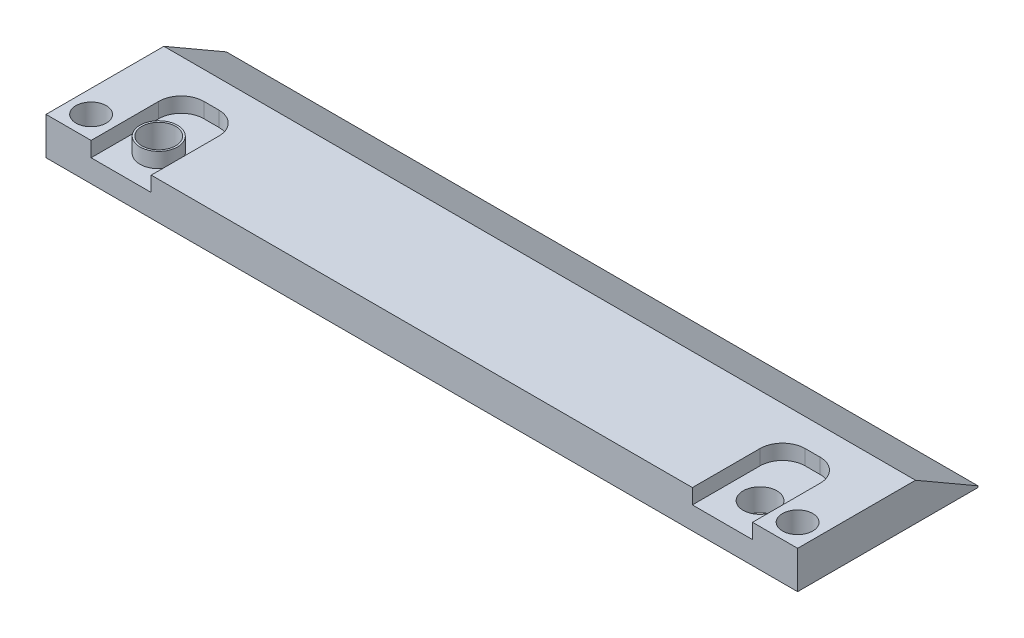
ISO-10303-21;
HEADER;
FILE_DESCRIPTION(('STEP AP214'),'2;1');
FILE_NAME('part.step','',(''),(''),'','','');
FILE_SCHEMA(('AUTOMOTIVE_DESIGN { 1 0 10303 214 1 1 1 1 }'));
ENDSEC;
DATA;
#1=APPLICATION_CONTEXT('core data for automotive mechanical design processes');
#2=APPLICATION_PROTOCOL_DEFINITION('international standard','automotive_design',2000,#1);
#3=PRODUCT_CONTEXT('',#1,'mechanical');
#4=PRODUCT('Part','Part','',(#3));
#5=PRODUCT_RELATED_PRODUCT_CATEGORY('part','',(#4));
#6=PRODUCT_DEFINITION_FORMATION('','',#4);
#7=PRODUCT_DEFINITION_CONTEXT('part definition',#1,'design');
#8=PRODUCT_DEFINITION('design','',#6,#7);
#9=PRODUCT_DEFINITION_SHAPE('','',#8);
#10=(LENGTH_UNIT() NAMED_UNIT(*) SI_UNIT(.MILLI.,.METRE.));
#11=(NAMED_UNIT(*) PLANE_ANGLE_UNIT() SI_UNIT($,.RADIAN.));
#12=(NAMED_UNIT(*) SI_UNIT($,.STERADIAN.) SOLID_ANGLE_UNIT());
#13=UNCERTAINTY_MEASURE_WITH_UNIT(LENGTH_MEASURE(1.E-05),#10,'distance_accuracy_value','');
#14=(GEOMETRIC_REPRESENTATION_CONTEXT(3) GLOBAL_UNCERTAINTY_ASSIGNED_CONTEXT((#13)) GLOBAL_UNIT_ASSIGNED_CONTEXT((#10,
#11,#12)) REPRESENTATION_CONTEXT('',''));
#15=CARTESIAN_POINT('',(0.,0.,0.));
#16=DIRECTION('',(0.,0.,1.));
#17=DIRECTION('',(1.,0.,0.));
#18=AXIS2_PLACEMENT_3D('',#15,#16,#17);
#19=CARTESIAN_POINT('',(40.,5.,6.99999999999999));
#20=DIRECTION('',(0.,-1.,0.));
#21=DIRECTION('',(0.,0.,-1.));
#22=AXIS2_PLACEMENT_3D('',#19,#20,#21);
#23=CYLINDRICAL_SURFACE('',#22,2.25);
#24=CARTESIAN_POINT('',(40.,0.,6.99999999999999));
#25=DIRECTION('',(0.,1.,0.));
#26=DIRECTION('',(0.,0.,1.));
#27=AXIS2_PLACEMENT_3D('',#24,#25,#26);
#28=CIRCLE('',#27,2.25);
#29=CARTESIAN_POINT('',(40.,0.,9.24999999999999));
#30=VERTEX_POINT('',#29);
#31=EDGE_CURVE('E323',#30,#30,#28,.F.);
#32=ORIENTED_EDGE('',*,*,#31,.T.);
#33=EDGE_LOOP('',(#32));
#34=FACE_BOUND('',#33,.T.);
#35=CARTESIAN_POINT('',(40.,3.,6.99999999999999));
#36=DIRECTION('',(0.,1.,0.));
#37=DIRECTION('',(0.,0.,1.));
#38=AXIS2_PLACEMENT_3D('',#35,#36,#37);
#39=CIRCLE('',#38,2.25);
#40=CARTESIAN_POINT('',(40.,3.,9.24999999999999));
#41=VERTEX_POINT('',#40);
#42=EDGE_CURVE('E199',#41,#41,#39,.F.);
#43=ORIENTED_EDGE('',*,*,#42,.F.);
#44=EDGE_LOOP('',(#43));
#45=FACE_BOUND('',#44,.T.);
#46=ADVANCED_FACE('F41',(#34,#45),#23,.F.);
#47=CARTESIAN_POINT('',(0.,5.,0.));
#48=DIRECTION('',(0.,1.,0.));
#49=DIRECTION('',(0.,0.,1.));
#50=AXIS2_PLACEMENT_3D('',#47,#48,#49);
#51=PLANE('',#50);
#52=CARTESIAN_POINT('',(-40.,5.,7.));
#53=DIRECTION('',(0.,1.,0.));
#54=DIRECTION('',(0.,0.,1.));
#55=AXIS2_PLACEMENT_3D('',#52,#53,#54);
#56=CIRCLE('',#55,2.25);
#57=CARTESIAN_POINT('',(-40.,5.,9.25));
#58=VERTEX_POINT('',#57);
#59=EDGE_CURVE('E182',#58,#58,#56,.T.);
#60=ORIENTED_EDGE('',*,*,#59,.F.);
#61=EDGE_LOOP('',(#60));
#62=FACE_BOUND('',#61,.T.);
#63=CARTESIAN_POINT('',(-40.,5.,7.00000000000033));
#64=DIRECTION('',(0.,1.,0.));
#65=DIRECTION('',(0.,0.,1.));
#66=AXIS2_PLACEMENT_3D('',#63,#64,#65);
#67=CIRCLE('',#66,2.5);
#68=CARTESIAN_POINT('',(-40.,5.,9.50000000000033));
#69=VERTEX_POINT('',#68);
#70=EDGE_CURVE('E281',#69,#69,#67,.T.);
#71=ORIENTED_EDGE('',*,*,#70,.T.);
#72=EDGE_LOOP('',(#71));
#73=FACE_BOUND('',#72,.T.);
#74=ADVANCED_FACE('F352',(#62,#73),#51,.T.);
#75=CARTESIAN_POINT('',(-50.,5.,0.));
#76=DIRECTION('',(1.,0.,0.));
#77=DIRECTION('',(0.,0.,-1.));
#78=AXIS2_PLACEMENT_3D('',#75,#76,#77);
#79=PLANE('',#78);
#80=DIRECTION('',(0.,0.,1.));
#81=VECTOR('',#80,1.);
#82=CARTESIAN_POINT('',(-50.,5.,0.));
#83=LINE('',#82,#81);
#84=CARTESIAN_POINT('',(-50.,5.,-3.68615612366942));
#85=VERTEX_POINT('',#84);
#86=CARTESIAN_POINT('',(-50.,5.,12.));
#87=VERTEX_POINT('',#86);
#88=EDGE_CURVE('E173',#85,#87,#83,.T.);
#89=ORIENTED_EDGE('',*,*,#88,.F.);
#90=DIRECTION('',(0.,0.500000000000001,0.866025403784438));
#91=VECTOR('',#90,1.);
#92=CARTESIAN_POINT('',(-50.,5.34615242270664,-3.08660254037846));
#93=LINE('',#92,#91);
#94=CARTESIAN_POINT('',(-50.,0.2,-12.));
#95=VERTEX_POINT('',#94);
#96=EDGE_CURVE('E56',#95,#85,#93,.T.);
#97=ORIENTED_EDGE('',*,*,#96,.F.);
#98=DIRECTION('',(0.,-1.,0.));
#99=VECTOR('',#98,1.);
#100=CARTESIAN_POINT('',(-50.,5.,-12.));
#101=LINE('',#100,#99);
#102=CARTESIAN_POINT('',(-50.,0.,-12.));
#103=VERTEX_POINT('',#102);
#104=EDGE_CURVE('E170',#95,#103,#101,.T.);
#105=ORIENTED_EDGE('',*,*,#104,.T.);
#106=DIRECTION('',(0.,0.,1.));
#107=VECTOR('',#106,1.);
#108=CARTESIAN_POINT('',(-50.,0.,0.));
#109=LINE('',#108,#107);
#110=CARTESIAN_POINT('',(-50.,0.,12.));
#111=VERTEX_POINT('',#110);
#112=EDGE_CURVE('E202',#103,#111,#109,.T.);
#113=ORIENTED_EDGE('',*,*,#112,.T.);
#114=DIRECTION('',(0.,-1.,0.));
#115=VECTOR('',#114,1.);
#116=CARTESIAN_POINT('',(-50.,5.,12.));
#117=LINE('',#116,#115);
#118=EDGE_CURVE('E50',#87,#111,#117,.T.);
#119=ORIENTED_EDGE('',*,*,#118,.F.);
#120=EDGE_LOOP('',(#89,#97,#105,#113,#119));
#121=FACE_BOUND('',#120,.T.);
#122=ADVANCED_FACE('F43',(#121),#79,.F.);
#123=CARTESIAN_POINT('',(0.,5.,12.));
#124=DIRECTION('',(0.,0.,-1.));
#125=DIRECTION('',(-1.,0.,0.));
#126=AXIS2_PLACEMENT_3D('',#123,#124,#125);
#127=PLANE('',#126);
#128=DIRECTION('',(1.,0.,0.));
#129=VECTOR('',#128,1.);
#130=CARTESIAN_POINT('',(0.,5.,12.));
#131=LINE('',#130,#129);
#132=CARTESIAN_POINT('',(-36.,5.,12.));
#133=VERTEX_POINT('',#132);
#134=CARTESIAN_POINT('',(36.,5.,12.));
#135=VERTEX_POINT('',#134);
#136=EDGE_CURVE('E304',#133,#135,#131,.T.);
#137=ORIENTED_EDGE('',*,*,#136,.F.);
#138=DIRECTION('',(0.,1.,0.));
#139=VECTOR('',#138,1.);
#140=CARTESIAN_POINT('',(-36.,3.,12.));
#141=LINE('',#140,#139);
#142=CARTESIAN_POINT('',(-36.,3.,12.));
#143=VERTEX_POINT('',#142);
#144=EDGE_CURVE('E203',#143,#133,#141,.T.);
#145=ORIENTED_EDGE('',*,*,#144,.F.);
#146=DIRECTION('',(1.,0.,0.));
#147=VECTOR('',#146,1.);
#148=CARTESIAN_POINT('',(-44.,3.,12.));
#149=LINE('',#148,#147);
#150=CARTESIAN_POINT('',(-44.,3.,12.));
#151=VERTEX_POINT('',#150);
#152=EDGE_CURVE('E232',#151,#143,#149,.T.);
#153=ORIENTED_EDGE('',*,*,#152,.F.);
#154=DIRECTION('',(0.,1.,0.));
#155=VECTOR('',#154,1.);
#156=CARTESIAN_POINT('',(-44.,3.,12.));
#157=LINE('',#156,#155);
#158=CARTESIAN_POINT('',(-44.,5.,12.));
#159=VERTEX_POINT('',#158);
#160=EDGE_CURVE('E210',#151,#159,#157,.T.);
#161=ORIENTED_EDGE('',*,*,#160,.T.);
#162=EDGE_CURVE('E299',#87,#159,#131,.T.);
#163=ORIENTED_EDGE('',*,*,#162,.F.);
#164=ORIENTED_EDGE('',*,*,#118,.T.);
#165=DIRECTION('',(1.,0.,0.));
#166=VECTOR('',#165,1.);
#167=CARTESIAN_POINT('',(0.,0.,12.));
#168=LINE('',#167,#166);
#169=CARTESIAN_POINT('',(50.,0.,12.));
#170=VERTEX_POINT('',#169);
#171=EDGE_CURVE('E208',#111,#170,#168,.T.);
#172=ORIENTED_EDGE('',*,*,#171,.T.);
#173=DIRECTION('',(0.,-1.,0.));
#174=VECTOR('',#173,1.);
#175=CARTESIAN_POINT('',(50.,5.,12.));
#176=LINE('',#175,#174);
#177=CARTESIAN_POINT('',(50.,5.,12.));
#178=VERTEX_POINT('',#177);
#179=EDGE_CURVE('E186',#178,#170,#176,.T.);
#180=ORIENTED_EDGE('',*,*,#179,.F.);
#181=CARTESIAN_POINT('',(44.,5.,12.));
#182=VERTEX_POINT('',#181);
#183=EDGE_CURVE('E298',#182,#178,#131,.T.);
#184=ORIENTED_EDGE('',*,*,#183,.F.);
#185=DIRECTION('',(0.,1.,0.));
#186=VECTOR('',#185,1.);
#187=CARTESIAN_POINT('',(44.,3.,12.));
#188=LINE('',#187,#186);
#189=CARTESIAN_POINT('',(44.,3.,12.));
#190=VERTEX_POINT('',#189);
#191=EDGE_CURVE('E258',#190,#182,#188,.T.);
#192=ORIENTED_EDGE('',*,*,#191,.F.);
#193=DIRECTION('',(1.,0.,0.));
#194=VECTOR('',#193,1.);
#195=CARTESIAN_POINT('',(44.,3.,12.));
#196=LINE('',#195,#194);
#197=CARTESIAN_POINT('',(36.,3.,12.));
#198=VERTEX_POINT('',#197);
#199=EDGE_CURVE('E233',#198,#190,#196,.T.);
#200=ORIENTED_EDGE('',*,*,#199,.F.);
#201=DIRECTION('',(0.,1.,0.));
#202=VECTOR('',#201,1.);
#203=CARTESIAN_POINT('',(36.,3.,12.));
#204=LINE('',#203,#202);
#205=EDGE_CURVE('E277',#198,#135,#204,.T.);
#206=ORIENTED_EDGE('',*,*,#205,.T.);
#207=EDGE_LOOP('',(#137,#145,#153,#161,#163,#164,#172,#180,#184,#192,#200,#206));
#208=FACE_BOUND('',#207,.T.);
#209=ADVANCED_FACE('F370',(#208),#127,.F.);
#210=CARTESIAN_POINT('',(50.,5.,0.));
#211=DIRECTION('',(1.,0.,0.));
#212=DIRECTION('',(0.,0.,-1.));
#213=AXIS2_PLACEMENT_3D('',#210,#211,#212);
#214=PLANE('',#213);
#215=DIRECTION('',(0.,-0.500000000000001,-0.866025403784438));
#216=VECTOR('',#215,1.);
#217=CARTESIAN_POINT('',(50.,6.59615242270665,-0.921539030917359));
#218=LINE('',#217,#216);
#219=CARTESIAN_POINT('',(50.,5.,-3.68615612366942));
#220=VERTEX_POINT('',#219);
#221=CARTESIAN_POINT('',(50.,0.2,-12.));
#222=VERTEX_POINT('',#221);
#223=EDGE_CURVE('E161',#220,#222,#218,.T.);
#224=ORIENTED_EDGE('',*,*,#223,.F.);
#225=DIRECTION('',(0.,0.,1.));
#226=VECTOR('',#225,1.);
#227=CARTESIAN_POINT('',(50.,5.,0.));
#228=LINE('',#227,#226);
#229=EDGE_CURVE('E303',#220,#178,#228,.T.);
#230=ORIENTED_EDGE('',*,*,#229,.T.);
#231=ORIENTED_EDGE('',*,*,#179,.T.);
#232=DIRECTION('',(0.,0.,1.));
#233=VECTOR('',#232,1.);
#234=CARTESIAN_POINT('',(50.,0.,0.));
#235=LINE('',#234,#233);
#236=CARTESIAN_POINT('',(50.,0.,-12.));
#237=VERTEX_POINT('',#236);
#238=EDGE_CURVE('E317',#237,#170,#235,.T.);
#239=ORIENTED_EDGE('',*,*,#238,.F.);
#240=DIRECTION('',(0.,-1.,0.));
#241=VECTOR('',#240,1.);
#242=CARTESIAN_POINT('',(50.,5.,-12.));
#243=LINE('',#242,#241);
#244=EDGE_CURVE('E181',#222,#237,#243,.T.);
#245=ORIENTED_EDGE('',*,*,#244,.F.);
#246=EDGE_LOOP('',(#224,#230,#231,#239,#245));
#247=FACE_BOUND('',#246,.T.);
#248=ADVANCED_FACE('F367',(#247),#214,.T.);
#249=CARTESIAN_POINT('',(47.,5.,9.));
#250=DIRECTION('',(0.,-1.,0.));
#251=DIRECTION('',(0.,0.,-1.));
#252=AXIS2_PLACEMENT_3D('',#249,#250,#251);
#253=CYLINDRICAL_SURFACE('',#252,2.01750494210506);
#254=CARTESIAN_POINT('',(47.,5.,9.));
#255=DIRECTION('',(0.,1.,0.));
#256=DIRECTION('',(0.,0.,1.));
#257=AXIS2_PLACEMENT_3D('',#254,#255,#256);
#258=CIRCLE('',#257,2.01750494210506);
#259=CARTESIAN_POINT('',(47.,5.,11.0175049421051));
#260=VERTEX_POINT('',#259);
#261=EDGE_CURVE('E189',#260,#260,#258,.F.);
#262=ORIENTED_EDGE('',*,*,#261,.F.);
#263=EDGE_LOOP('',(#262));
#264=FACE_BOUND('',#263,.T.);
#265=CARTESIAN_POINT('',(47.,0.,9.));
#266=DIRECTION('',(0.,1.,0.));
#267=DIRECTION('',(0.,0.,1.));
#268=AXIS2_PLACEMENT_3D('',#265,#266,#267);
#269=CIRCLE('',#268,2.01750494210506);
#270=CARTESIAN_POINT('',(47.,0.,11.0175049421051));
#271=VERTEX_POINT('',#270);
#272=EDGE_CURVE('E330',#271,#271,#269,.F.);
#273=ORIENTED_EDGE('',*,*,#272,.T.);
#274=EDGE_LOOP('',(#273));
#275=FACE_BOUND('',#274,.T.);
#276=ADVANCED_FACE('F369',(#264,#275),#253,.F.);
#277=CARTESIAN_POINT('',(-47.,5.,9.));
#278=DIRECTION('',(0.,-1.,0.));
#279=DIRECTION('',(0.,0.,-1.));
#280=AXIS2_PLACEMENT_3D('',#277,#278,#279);
#281=CYLINDRICAL_SURFACE('',#280,2.01750494210506);
#282=CARTESIAN_POINT('',(-47.,5.,9.));
#283=DIRECTION('',(0.,1.,0.));
#284=DIRECTION('',(0.,0.,1.));
#285=AXIS2_PLACEMENT_3D('',#282,#283,#284);
#286=CIRCLE('',#285,2.01750494210506);
#287=CARTESIAN_POINT('',(-47.,5.,11.0175049421051));
#288=VERTEX_POINT('',#287);
#289=EDGE_CURVE('E307',#288,#288,#286,.T.);
#290=ORIENTED_EDGE('',*,*,#289,.T.);
#291=EDGE_LOOP('',(#290));
#292=FACE_BOUND('',#291,.T.);
#293=CARTESIAN_POINT('',(-47.,0.,9.));
#294=DIRECTION('',(0.,1.,0.));
#295=DIRECTION('',(0.,0.,1.));
#296=AXIS2_PLACEMENT_3D('',#293,#294,#295);
#297=CIRCLE('',#296,2.01750494210506);
#298=CARTESIAN_POINT('',(-47.,0.,11.0175049421051));
#299=VERTEX_POINT('',#298);
#300=EDGE_CURVE('E327',#299,#299,#297,.T.);
#301=ORIENTED_EDGE('',*,*,#300,.F.);
#302=EDGE_LOOP('',(#301));
#303=FACE_BOUND('',#302,.T.);
#304=ADVANCED_FACE('F353',(#292,#303),#281,.F.);
#305=CARTESIAN_POINT('',(0.,5.,-12.));
#306=DIRECTION('',(0.,0.,-1.));
#307=DIRECTION('',(-1.,0.,0.));
#308=AXIS2_PLACEMENT_3D('',#305,#306,#307);
#309=PLANE('',#308);
#310=DIRECTION('',(-1.,0.,0.));
#311=VECTOR('',#310,1.);
#312=CARTESIAN_POINT('',(91.,0.2,-12.));
#313=LINE('',#312,#311);
#314=EDGE_CURVE('E158',#222,#95,#313,.T.);
#315=ORIENTED_EDGE('',*,*,#314,.F.);
#316=ORIENTED_EDGE('',*,*,#244,.T.);
#317=DIRECTION('',(1.,0.,0.));
#318=VECTOR('',#317,1.);
#319=CARTESIAN_POINT('',(0.,0.,-12.));
#320=LINE('',#319,#318);
#321=EDGE_CURVE('E179',#103,#237,#320,.T.);
#322=ORIENTED_EDGE('',*,*,#321,.F.);
#323=ORIENTED_EDGE('',*,*,#104,.F.);
#324=EDGE_LOOP('',(#315,#316,#322,#323));
#325=FACE_BOUND('',#324,.T.);
#326=ADVANCED_FACE('F177',(#325),#309,.T.);
#327=CARTESIAN_POINT('',(-40.,5.,7.));
#328=DIRECTION('',(0.,-1.,0.));
#329=DIRECTION('',(0.,0.,-1.));
#330=AXIS2_PLACEMENT_3D('',#327,#328,#329);
#331=CYLINDRICAL_SURFACE('',#330,2.25);
#332=ORIENTED_EDGE('',*,*,#59,.T.);
#333=EDGE_LOOP('',(#332));
#334=FACE_BOUND('',#333,.T.);
#335=CARTESIAN_POINT('',(-40.,0.,7.));
#336=DIRECTION('',(0.,1.,0.));
#337=DIRECTION('',(0.,0.,1.));
#338=AXIS2_PLACEMENT_3D('',#335,#336,#337);
#339=CIRCLE('',#338,2.25);
#340=CARTESIAN_POINT('',(-40.,0.,9.25));
#341=VERTEX_POINT('',#340);
#342=EDGE_CURVE('E192',#341,#341,#339,.T.);
#343=ORIENTED_EDGE('',*,*,#342,.F.);
#344=EDGE_LOOP('',(#343));
#345=FACE_BOUND('',#344,.T.);
#346=ADVANCED_FACE('F341',(#334,#345),#331,.F.);
#347=DIRECTION('',(1.,0.,0.));
#348=VECTOR('',#347,1.);
#349=CARTESIAN_POINT('',(0.,5.,-3.68615612366942));
#350=LINE('',#349,#348);
#351=EDGE_CURVE('E11',#85,#220,#350,.T.);
#352=ORIENTED_EDGE('',*,*,#351,.F.);
#353=ORIENTED_EDGE('',*,*,#88,.T.);
#354=ORIENTED_EDGE('',*,*,#162,.T.);
#355=DIRECTION('',(0.,0.,1.));
#356=VECTOR('',#355,1.);
#357=CARTESIAN_POINT('',(-44.,5.,3.00000000000002));
#358=LINE('',#357,#356);
#359=CARTESIAN_POINT('',(-44.,5.,3.00000000000002));
#360=VERTEX_POINT('',#359);
#361=EDGE_CURVE('E218',#360,#159,#358,.T.);
#362=ORIENTED_EDGE('',*,*,#361,.F.);
#363=CARTESIAN_POINT('',(-41.,5.,3.));
#364=DIRECTION('',(0.,1.,0.));
#365=DIRECTION('',(0.,0.,1.));
#366=AXIS2_PLACEMENT_3D('',#363,#364,#365);
#367=CIRCLE('',#366,3.);
#368=CARTESIAN_POINT('',(-41.,5.,0.));
#369=VERTEX_POINT('',#368);
#370=EDGE_CURVE('E435',#369,#360,#367,.T.);
#371=ORIENTED_EDGE('',*,*,#370,.F.);
#372=DIRECTION('',(-1.,0.,0.));
#373=VECTOR('',#372,1.);
#374=CARTESIAN_POINT('',(-41.,5.,0.));
#375=LINE('',#374,#373);
#376=CARTESIAN_POINT('',(-39.,5.,0.));
#377=VERTEX_POINT('',#376);
#378=EDGE_CURVE('E432',#377,#369,#375,.T.);
#379=ORIENTED_EDGE('',*,*,#378,.F.);
#380=CARTESIAN_POINT('',(-39.,5.,3.));
#381=DIRECTION('',(0.,1.,0.));
#382=DIRECTION('',(0.,0.,-1.));
#383=AXIS2_PLACEMENT_3D('',#380,#381,#382);
#384=CIRCLE('',#383,3.);
#385=CARTESIAN_POINT('',(-36.,5.,3.00000000000002));
#386=VERTEX_POINT('',#385);
#387=EDGE_CURVE('E428',#386,#377,#384,.T.);
#388=ORIENTED_EDGE('',*,*,#387,.F.);
#389=DIRECTION('',(0.,0.,-1.));
#390=VECTOR('',#389,1.);
#391=CARTESIAN_POINT('',(-36.,5.,3.00000000000002));
#392=LINE('',#391,#390);
#393=EDGE_CURVE('E64',#133,#386,#392,.T.);
#394=ORIENTED_EDGE('',*,*,#393,.F.);
#395=ORIENTED_EDGE('',*,*,#136,.T.);
#396=DIRECTION('',(0.,0.,1.));
#397=VECTOR('',#396,1.);
#398=CARTESIAN_POINT('',(36.,5.,3.00000000000002));
#399=LINE('',#398,#397);
#400=CARTESIAN_POINT('',(36.,5.,3.00000000000002));
#401=VERTEX_POINT('',#400);
#402=EDGE_CURVE('E238',#401,#135,#399,.T.);
#403=ORIENTED_EDGE('',*,*,#402,.F.);
#404=CARTESIAN_POINT('',(39.,5.,3.));
#405=DIRECTION('',(0.,1.,0.));
#406=DIRECTION('',(0.,0.,1.));
#407=AXIS2_PLACEMENT_3D('',#404,#405,#406);
#408=CIRCLE('',#407,3.);
#409=CARTESIAN_POINT('',(39.,5.,0.));
#410=VERTEX_POINT('',#409);
#411=EDGE_CURVE('E271',#410,#401,#408,.T.);
#412=ORIENTED_EDGE('',*,*,#411,.F.);
#413=DIRECTION('',(-1.,0.,0.));
#414=VECTOR('',#413,1.);
#415=CARTESIAN_POINT('',(41.,5.,0.));
#416=LINE('',#415,#414);
#417=CARTESIAN_POINT('',(41.,5.,0.));
#418=VERTEX_POINT('',#417);
#419=EDGE_CURVE('E267',#418,#410,#416,.T.);
#420=ORIENTED_EDGE('',*,*,#419,.F.);
#421=CARTESIAN_POINT('',(41.,5.,3.));
#422=DIRECTION('',(0.,1.,0.));
#423=DIRECTION('',(0.,0.,-1.));
#424=AXIS2_PLACEMENT_3D('',#421,#422,#423);
#425=CIRCLE('',#424,3.);
#426=CARTESIAN_POINT('',(44.,5.,3.00000000000002));
#427=VERTEX_POINT('',#426);
#428=EDGE_CURVE('E263',#427,#418,#425,.T.);
#429=ORIENTED_EDGE('',*,*,#428,.F.);
#430=DIRECTION('',(0.,0.,-1.));
#431=VECTOR('',#430,1.);
#432=CARTESIAN_POINT('',(44.,5.,3.00000000000002));
#433=LINE('',#432,#431);
#434=EDGE_CURVE('E259',#182,#427,#433,.T.);
#435=ORIENTED_EDGE('',*,*,#434,.F.);
#436=ORIENTED_EDGE('',*,*,#183,.T.);
#437=ORIENTED_EDGE('',*,*,#229,.F.);
#438=EDGE_LOOP('',(#352,#353,#354,#362,#371,#379,#388,#394,#395,#403,#412,#420,#429,#435,#436,#437));
#439=FACE_BOUND('',#438,.T.);
#440=ORIENTED_EDGE('',*,*,#289,.F.);
#441=EDGE_LOOP('',(#440));
#442=FACE_BOUND('',#441,.T.);
#443=ORIENTED_EDGE('',*,*,#261,.T.);
#444=EDGE_LOOP('',(#443));
#445=FACE_BOUND('',#444,.T.);
#446=ADVANCED_FACE('F343',(#439,#442,#445),#51,.T.);
#447=CARTESIAN_POINT('',(0.,0.,0.));
#448=DIRECTION('',(0.,1.,0.));
#449=DIRECTION('',(0.,0.,1.));
#450=AXIS2_PLACEMENT_3D('',#447,#448,#449);
#451=PLANE('',#450);
#452=ORIENTED_EDGE('',*,*,#112,.F.);
#453=ORIENTED_EDGE('',*,*,#321,.T.);
#454=ORIENTED_EDGE('',*,*,#238,.T.);
#455=ORIENTED_EDGE('',*,*,#171,.F.);
#456=EDGE_LOOP('',(#452,#453,#454,#455));
#457=FACE_BOUND('',#456,.T.);
#458=ORIENTED_EDGE('',*,*,#31,.F.);
#459=EDGE_LOOP('',(#458));
#460=FACE_BOUND('',#459,.T.);
#461=ORIENTED_EDGE('',*,*,#300,.T.);
#462=EDGE_LOOP('',(#461));
#463=FACE_BOUND('',#462,.T.);
#464=ORIENTED_EDGE('',*,*,#272,.F.);
#465=EDGE_LOOP('',(#464));
#466=FACE_BOUND('',#465,.T.);
#467=ORIENTED_EDGE('',*,*,#342,.T.);
#468=EDGE_LOOP('',(#467));
#469=FACE_BOUND('',#468,.T.);
#470=ADVANCED_FACE('F339',(#457,#460,#463,#466,#469),#451,.F.);
#471=CARTESIAN_POINT('',(39.,3.,3.));
#472=DIRECTION('',(0.,1.,0.));
#473=DIRECTION('',(0.,0.,1.));
#474=AXIS2_PLACEMENT_3D('',#471,#472,#473);
#475=PLANE('',#474);
#476=ORIENTED_EDGE('',*,*,#199,.T.);
#477=DIRECTION('',(0.,0.,-1.));
#478=VECTOR('',#477,1.);
#479=CARTESIAN_POINT('',(44.,3.,3.00000000000002));
#480=LINE('',#479,#478);
#481=CARTESIAN_POINT('',(44.,3.,3.00000000000002));
#482=VERTEX_POINT('',#481);
#483=EDGE_CURVE('E237',#190,#482,#480,.T.);
#484=ORIENTED_EDGE('',*,*,#483,.T.);
#485=CARTESIAN_POINT('',(41.,3.,3.));
#486=DIRECTION('',(0.,1.,0.));
#487=DIRECTION('',(0.,0.,-1.));
#488=AXIS2_PLACEMENT_3D('',#485,#486,#487);
#489=CIRCLE('',#488,3.);
#490=CARTESIAN_POINT('',(41.,3.,0.));
#491=VERTEX_POINT('',#490);
#492=EDGE_CURVE('E242',#482,#491,#489,.T.);
#493=ORIENTED_EDGE('',*,*,#492,.T.);
#494=DIRECTION('',(-1.,0.,0.));
#495=VECTOR('',#494,1.);
#496=CARTESIAN_POINT('',(41.,3.,0.));
#497=LINE('',#496,#495);
#498=CARTESIAN_POINT('',(39.,3.,0.));
#499=VERTEX_POINT('',#498);
#500=EDGE_CURVE('E246',#491,#499,#497,.T.);
#501=ORIENTED_EDGE('',*,*,#500,.T.);
#502=CARTESIAN_POINT('',(39.,3.,3.));
#503=DIRECTION('',(0.,1.,0.));
#504=DIRECTION('',(0.,0.,1.));
#505=AXIS2_PLACEMENT_3D('',#502,#503,#504);
#506=CIRCLE('',#505,3.);
#507=CARTESIAN_POINT('',(36.,3.,3.00000000000002));
#508=VERTEX_POINT('',#507);
#509=EDGE_CURVE('E250',#499,#508,#506,.T.);
#510=ORIENTED_EDGE('',*,*,#509,.T.);
#511=DIRECTION('',(0.,0.,1.));
#512=VECTOR('',#511,1.);
#513=CARTESIAN_POINT('',(36.,3.,3.00000000000002));
#514=LINE('',#513,#512);
#515=EDGE_CURVE('E254',#508,#198,#514,.T.);
#516=ORIENTED_EDGE('',*,*,#515,.T.);
#517=EDGE_LOOP('',(#476,#484,#493,#501,#510,#516));
#518=FACE_BOUND('',#517,.T.);
#519=ORIENTED_EDGE('',*,*,#42,.T.);
#520=EDGE_LOOP('',(#519));
#521=FACE_BOUND('',#520,.T.);
#522=ADVANCED_FACE('F473',(#518,#521),#475,.T.);
#523=CARTESIAN_POINT('',(36.,3.,3.00000000000002));
#524=DIRECTION('',(-1.,0.,0.));
#525=DIRECTION('',(0.,0.,1.));
#526=AXIS2_PLACEMENT_3D('',#523,#524,#525);
#527=PLANE('',#526);
#528=ORIENTED_EDGE('',*,*,#402,.T.);
#529=ORIENTED_EDGE('',*,*,#205,.F.);
#530=ORIENTED_EDGE('',*,*,#515,.F.);
#531=DIRECTION('',(0.,1.,0.));
#532=VECTOR('',#531,1.);
#533=CARTESIAN_POINT('',(36.,3.,3.00000000000002));
#534=LINE('',#533,#532);
#535=EDGE_CURVE('E282',#508,#401,#534,.T.);
#536=ORIENTED_EDGE('',*,*,#535,.T.);
#537=EDGE_LOOP('',(#528,#529,#530,#536));
#538=FACE_BOUND('',#537,.T.);
#539=ADVANCED_FACE('F476',(#538),#527,.F.);
#540=CARTESIAN_POINT('',(39.,3.,3.));
#541=DIRECTION('',(0.,1.,0.));
#542=DIRECTION('',(0.,0.,1.));
#543=AXIS2_PLACEMENT_3D('',#540,#541,#542);
#544=CYLINDRICAL_SURFACE('',#543,3.);
#545=ORIENTED_EDGE('',*,*,#411,.T.);
#546=ORIENTED_EDGE('',*,*,#535,.F.);
#547=ORIENTED_EDGE('',*,*,#509,.F.);
#548=DIRECTION('',(0.,1.,0.));
#549=VECTOR('',#548,1.);
#550=CARTESIAN_POINT('',(39.,3.,0.));
#551=LINE('',#550,#549);
#552=EDGE_CURVE('E285',#499,#410,#551,.T.);
#553=ORIENTED_EDGE('',*,*,#552,.T.);
#554=EDGE_LOOP('',(#545,#546,#547,#553));
#555=FACE_BOUND('',#554,.T.);
#556=ADVANCED_FACE('F480',(#555),#544,.F.);
#557=CARTESIAN_POINT('',(41.,3.,0.));
#558=DIRECTION('',(0.,0.,-1.));
#559=DIRECTION('',(-1.,0.,0.));
#560=AXIS2_PLACEMENT_3D('',#557,#558,#559);
#561=PLANE('',#560);
#562=ORIENTED_EDGE('',*,*,#419,.T.);
#563=ORIENTED_EDGE('',*,*,#552,.F.);
#564=ORIENTED_EDGE('',*,*,#500,.F.);
#565=DIRECTION('',(0.,1.,0.));
#566=VECTOR('',#565,1.);
#567=CARTESIAN_POINT('',(41.,3.,0.));
#568=LINE('',#567,#566);
#569=EDGE_CURVE('E288',#491,#418,#568,.T.);
#570=ORIENTED_EDGE('',*,*,#569,.T.);
#571=EDGE_LOOP('',(#562,#563,#564,#570));
#572=FACE_BOUND('',#571,.T.);
#573=ADVANCED_FACE('F484',(#572),#561,.F.);
#574=CARTESIAN_POINT('',(41.,3.,3.));
#575=DIRECTION('',(0.,1.,0.));
#576=DIRECTION('',(0.,0.,1.));
#577=AXIS2_PLACEMENT_3D('',#574,#575,#576);
#578=CYLINDRICAL_SURFACE('',#577,3.);
#579=ORIENTED_EDGE('',*,*,#428,.T.);
#580=ORIENTED_EDGE('',*,*,#569,.F.);
#581=ORIENTED_EDGE('',*,*,#492,.F.);
#582=DIRECTION('',(0.,1.,0.));
#583=VECTOR('',#582,1.);
#584=CARTESIAN_POINT('',(44.,3.,3.00000000000002));
#585=LINE('',#584,#583);
#586=EDGE_CURVE('E291',#482,#427,#585,.T.);
#587=ORIENTED_EDGE('',*,*,#586,.T.);
#588=EDGE_LOOP('',(#579,#580,#581,#587));
#589=FACE_BOUND('',#588,.T.);
#590=ADVANCED_FACE('F467',(#589),#578,.F.);
#591=CARTESIAN_POINT('',(44.,3.,3.00000000000002));
#592=DIRECTION('',(1.,0.,0.));
#593=DIRECTION('',(0.,0.,-1.));
#594=AXIS2_PLACEMENT_3D('',#591,#592,#593);
#595=PLANE('',#594);
#596=ORIENTED_EDGE('',*,*,#434,.T.);
#597=ORIENTED_EDGE('',*,*,#586,.F.);
#598=ORIENTED_EDGE('',*,*,#483,.F.);
#599=ORIENTED_EDGE('',*,*,#191,.T.);
#600=EDGE_LOOP('',(#596,#597,#598,#599));
#601=FACE_BOUND('',#600,.T.);
#602=ADVANCED_FACE('F460',(#601),#595,.F.);
#603=CARTESIAN_POINT('',(-36.,3.,3.00000000000002));
#604=DIRECTION('',(1.,0.,0.));
#605=DIRECTION('',(0.,0.,-1.));
#606=AXIS2_PLACEMENT_3D('',#603,#604,#605);
#607=PLANE('',#606);
#608=ORIENTED_EDGE('',*,*,#393,.T.);
#609=DIRECTION('',(0.,1.,0.));
#610=VECTOR('',#609,1.);
#611=CARTESIAN_POINT('',(-36.,3.,3.00000000000002));
#612=LINE('',#611,#610);
#613=CARTESIAN_POINT('',(-36.,3.,3.00000000000002));
#614=VERTEX_POINT('',#613);
#615=EDGE_CURVE('E229',#614,#386,#612,.T.);
#616=ORIENTED_EDGE('',*,*,#615,.F.);
#617=DIRECTION('',(0.,0.,-1.));
#618=VECTOR('',#617,1.);
#619=CARTESIAN_POINT('',(-36.,3.,3.00000000000002));
#620=LINE('',#619,#618);
#621=EDGE_CURVE('E403',#143,#614,#620,.T.);
#622=ORIENTED_EDGE('',*,*,#621,.F.);
#623=ORIENTED_EDGE('',*,*,#144,.T.);
#624=EDGE_LOOP('',(#608,#616,#622,#623));
#625=FACE_BOUND('',#624,.T.);
#626=ADVANCED_FACE('F458',(#625),#607,.F.);
#627=CARTESIAN_POINT('',(-44.,3.,3.00000000000002));
#628=DIRECTION('',(-1.,0.,0.));
#629=DIRECTION('',(0.,0.,1.));
#630=AXIS2_PLACEMENT_3D('',#627,#628,#629);
#631=PLANE('',#630);
#632=ORIENTED_EDGE('',*,*,#361,.T.);
#633=ORIENTED_EDGE('',*,*,#160,.F.);
#634=DIRECTION('',(0.,0.,1.));
#635=VECTOR('',#634,1.);
#636=CARTESIAN_POINT('',(-44.,3.,3.00000000000002));
#637=LINE('',#636,#635);
#638=CARTESIAN_POINT('',(-44.,3.,3.00000000000002));
#639=VERTEX_POINT('',#638);
#640=EDGE_CURVE('E419',#639,#151,#637,.T.);
#641=ORIENTED_EDGE('',*,*,#640,.F.);
#642=DIRECTION('',(0.,1.,0.));
#643=VECTOR('',#642,1.);
#644=CARTESIAN_POINT('',(-44.,3.,3.00000000000002));
#645=LINE('',#644,#643);
#646=EDGE_CURVE('E215',#639,#360,#645,.T.);
#647=ORIENTED_EDGE('',*,*,#646,.T.);
#648=EDGE_LOOP('',(#632,#633,#641,#647));
#649=FACE_BOUND('',#648,.T.);
#650=ADVANCED_FACE('F443',(#649),#631,.F.);
#651=CARTESIAN_POINT('',(-41.,3.,3.));
#652=DIRECTION('',(0.,1.,0.));
#653=DIRECTION('',(0.,0.,1.));
#654=AXIS2_PLACEMENT_3D('',#651,#652,#653);
#655=CYLINDRICAL_SURFACE('',#654,3.);
#656=ORIENTED_EDGE('',*,*,#370,.T.);
#657=ORIENTED_EDGE('',*,*,#646,.F.);
#658=CARTESIAN_POINT('',(-41.,3.,3.));
#659=DIRECTION('',(0.,1.,0.));
#660=DIRECTION('',(0.,0.,1.));
#661=AXIS2_PLACEMENT_3D('',#658,#659,#660);
#662=CIRCLE('',#661,3.);
#663=CARTESIAN_POINT('',(-41.,3.,0.));
#664=VERTEX_POINT('',#663);
#665=EDGE_CURVE('E415',#664,#639,#662,.T.);
#666=ORIENTED_EDGE('',*,*,#665,.F.);
#667=DIRECTION('',(0.,1.,0.));
#668=VECTOR('',#667,1.);
#669=CARTESIAN_POINT('',(-41.,3.,0.));
#670=LINE('',#669,#668);
#671=EDGE_CURVE('E223',#664,#369,#670,.T.);
#672=ORIENTED_EDGE('',*,*,#671,.T.);
#673=EDGE_LOOP('',(#656,#657,#666,#672));
#674=FACE_BOUND('',#673,.T.);
#675=ADVANCED_FACE('F450',(#674),#655,.F.);
#676=CARTESIAN_POINT('',(-41.,3.,0.));
#677=DIRECTION('',(0.,0.,-1.));
#678=DIRECTION('',(-1.,0.,0.));
#679=AXIS2_PLACEMENT_3D('',#676,#677,#678);
#680=PLANE('',#679);
#681=ORIENTED_EDGE('',*,*,#378,.T.);
#682=ORIENTED_EDGE('',*,*,#671,.F.);
#683=DIRECTION('',(-1.,0.,0.));
#684=VECTOR('',#683,1.);
#685=CARTESIAN_POINT('',(-41.,3.,0.));
#686=LINE('',#685,#684);
#687=CARTESIAN_POINT('',(-39.,3.,0.));
#688=VERTEX_POINT('',#687);
#689=EDGE_CURVE('E411',#688,#664,#686,.T.);
#690=ORIENTED_EDGE('',*,*,#689,.F.);
#691=DIRECTION('',(0.,1.,0.));
#692=VECTOR('',#691,1.);
#693=CARTESIAN_POINT('',(-39.,3.,0.));
#694=LINE('',#693,#692);
#695=EDGE_CURVE('E226',#688,#377,#694,.T.);
#696=ORIENTED_EDGE('',*,*,#695,.T.);
#697=EDGE_LOOP('',(#681,#682,#690,#696));
#698=FACE_BOUND('',#697,.T.);
#699=ADVANCED_FACE('F453',(#698),#680,.F.);
#700=CARTESIAN_POINT('',(-39.,3.,3.));
#701=DIRECTION('',(0.,1.,0.));
#702=DIRECTION('',(0.,0.,1.));
#703=AXIS2_PLACEMENT_3D('',#700,#701,#702);
#704=CYLINDRICAL_SURFACE('',#703,3.);
#705=ORIENTED_EDGE('',*,*,#387,.T.);
#706=ORIENTED_EDGE('',*,*,#695,.F.);
#707=CARTESIAN_POINT('',(-39.,3.,3.));
#708=DIRECTION('',(0.,1.,0.));
#709=DIRECTION('',(0.,0.,-1.));
#710=AXIS2_PLACEMENT_3D('',#707,#708,#709);
#711=CIRCLE('',#710,3.);
#712=EDGE_CURVE('E407',#614,#688,#711,.T.);
#713=ORIENTED_EDGE('',*,*,#712,.F.);
#714=ORIENTED_EDGE('',*,*,#615,.T.);
#715=EDGE_LOOP('',(#705,#706,#713,#714));
#716=FACE_BOUND('',#715,.T.);
#717=ADVANCED_FACE('F456',(#716),#704,.F.);
#718=CARTESIAN_POINT('',(-41.,3.,3.));
#719=DIRECTION('',(0.,1.,0.));
#720=DIRECTION('',(0.,0.,1.));
#721=AXIS2_PLACEMENT_3D('',#718,#719,#720);
#722=PLANE('',#721);
#723=CARTESIAN_POINT('',(-40.,3.,7.00000000000033));
#724=DIRECTION('',(0.,1.,0.));
#725=DIRECTION('',(0.,0.,1.));
#726=AXIS2_PLACEMENT_3D('',#723,#724,#725);
#727=CIRCLE('',#726,2.5);
#728=CARTESIAN_POINT('',(-40.,3.,9.50000000000033));
#729=VERTEX_POINT('',#728);
#730=EDGE_CURVE('E396',#729,#729,#727,.T.);
#731=ORIENTED_EDGE('',*,*,#730,.F.);
#732=EDGE_LOOP('',(#731));
#733=FACE_BOUND('',#732,.T.);
#734=ORIENTED_EDGE('',*,*,#621,.T.);
#735=ORIENTED_EDGE('',*,*,#712,.T.);
#736=ORIENTED_EDGE('',*,*,#689,.T.);
#737=ORIENTED_EDGE('',*,*,#665,.T.);
#738=ORIENTED_EDGE('',*,*,#640,.T.);
#739=ORIENTED_EDGE('',*,*,#152,.T.);
#740=EDGE_LOOP('',(#734,#735,#736,#737,#738,#739));
#741=FACE_BOUND('',#740,.T.);
#742=ADVANCED_FACE('F447',(#733,#741),#722,.T.);
#743=CARTESIAN_POINT('',(-40.,3.,7.00000000000033));
#744=DIRECTION('',(0.,1.,0.));
#745=DIRECTION('',(0.,0.,1.));
#746=AXIS2_PLACEMENT_3D('',#743,#744,#745);
#747=CYLINDRICAL_SURFACE('',#746,2.5);
#748=ORIENTED_EDGE('',*,*,#730,.T.);
#749=EDGE_LOOP('',(#748));
#750=FACE_BOUND('',#749,.T.);
#751=ORIENTED_EDGE('',*,*,#70,.F.);
#752=EDGE_LOOP('',(#751));
#753=FACE_BOUND('',#752,.T.);
#754=ADVANCED_FACE('F545',(#750,#753),#747,.T.);
#755=CARTESIAN_POINT('',(91.,5.34615242270664,-3.08660254037846));
#756=DIRECTION('',(0.,-0.866025403784438,0.500000000000001));
#757=DIRECTION('',(0.,-0.500000000000001,-0.866025403784438));
#758=AXIS2_PLACEMENT_3D('',#755,#756,#757);
#759=PLANE('',#758);
#760=ORIENTED_EDGE('',*,*,#223,.T.);
#761=ORIENTED_EDGE('',*,*,#314,.T.);
#762=ORIENTED_EDGE('',*,*,#96,.T.);
#763=ORIENTED_EDGE('',*,*,#351,.T.);
#764=EDGE_LOOP('',(#760,#761,#762,#763));
#765=FACE_BOUND('',#764,.T.);
#766=ADVANCED_FACE('F159',(#765),#759,.F.);
#767=CLOSED_SHELL('',(#46,#74,#122,#209,#248,#276,#304,#326,#346,#446,#470,#522,#539,#556,#573,
#590,#602,#626,#650,#675,#699,#717,#742,#754,#766));
#768=MANIFOLD_SOLID_BREP('B2',#767);
#769=ADVANCED_BREP_SHAPE_REPRESENTATION('',(#18,#768),#14);
#770=SHAPE_DEFINITION_REPRESENTATION(#9,#769);
ENDSEC;
END-ISO-10303-21;
